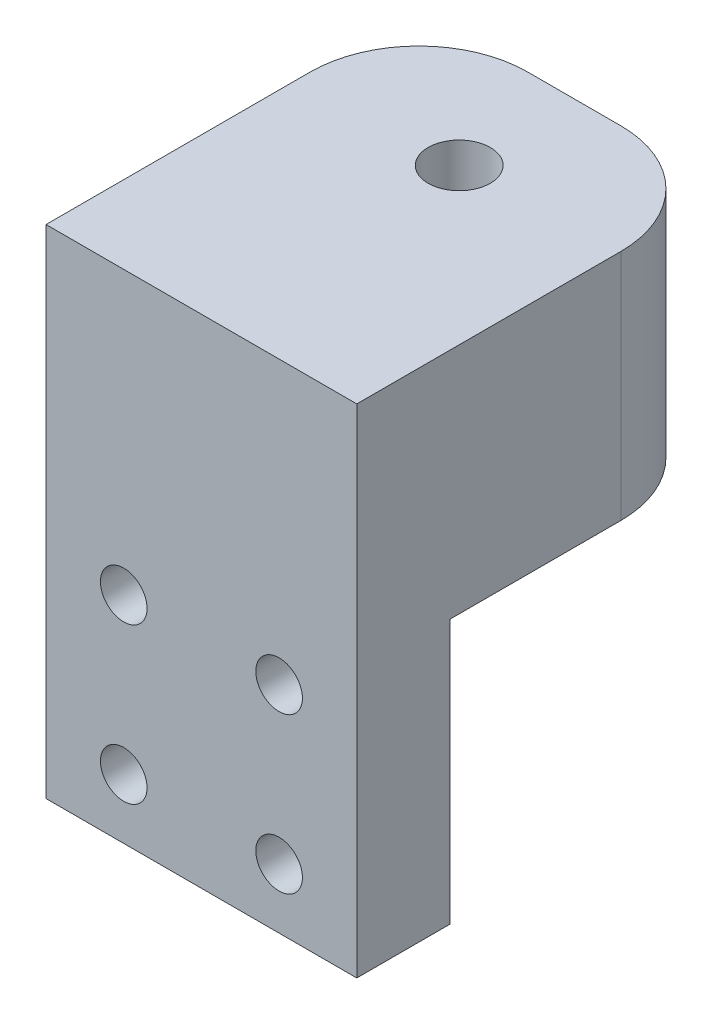
ISO-10303-21;
HEADER;
FILE_DESCRIPTION(('STEP AP214'),'2;1');
FILE_NAME('part.step','',(''),(''),'','','');
FILE_SCHEMA(('AUTOMOTIVE_DESIGN { 1 0 10303 214 1 1 1 1 }'));
ENDSEC;
DATA;
#1=APPLICATION_CONTEXT('core data for automotive mechanical design processes');
#2=APPLICATION_PROTOCOL_DEFINITION('international standard','automotive_design',2000,#1);
#3=PRODUCT_CONTEXT('',#1,'mechanical');
#4=PRODUCT('Part','Part','',(#3));
#5=PRODUCT_RELATED_PRODUCT_CATEGORY('part','',(#4));
#6=PRODUCT_DEFINITION_FORMATION('','',#4);
#7=PRODUCT_DEFINITION_CONTEXT('part definition',#1,'design');
#8=PRODUCT_DEFINITION('design','',#6,#7);
#9=PRODUCT_DEFINITION_SHAPE('','',#8);
#10=(LENGTH_UNIT() NAMED_UNIT(*) SI_UNIT(.MILLI.,.METRE.));
#11=(NAMED_UNIT(*) PLANE_ANGLE_UNIT() SI_UNIT($,.RADIAN.));
#12=(NAMED_UNIT(*) SI_UNIT($,.STERADIAN.) SOLID_ANGLE_UNIT());
#13=UNCERTAINTY_MEASURE_WITH_UNIT(LENGTH_MEASURE(1.E-05),#10,'distance_accuracy_value','');
#14=(GEOMETRIC_REPRESENTATION_CONTEXT(3) GLOBAL_UNCERTAINTY_ASSIGNED_CONTEXT((#13)) GLOBAL_UNIT_ASSIGNED_CONTEXT((#10,
#11,#12)) REPRESENTATION_CONTEXT('',''));
#15=CARTESIAN_POINT('',(0.,0.,0.));
#16=DIRECTION('',(0.,0.,1.));
#17=DIRECTION('',(1.,0.,0.));
#18=AXIS2_PLACEMENT_3D('',#15,#16,#17);
#19=CARTESIAN_POINT('',(-10.,0.,6.));
#20=DIRECTION('',(-1.,0.,0.));
#21=DIRECTION('',(0.,0.,1.));
#22=AXIS2_PLACEMENT_3D('',#19,#20,#21);
#23=PLANE('',#22);
#24=DIRECTION('',(0.,0.,1.));
#25=VECTOR('',#24,1.);
#26=CARTESIAN_POINT('',(-10.,22.,-18.));
#27=LINE('',#26,#25);
#28=CARTESIAN_POINT('',(-10.,22.,-11.));
#29=VERTEX_POINT('',#28);
#30=CARTESIAN_POINT('',(-10.,22.,6.));
#31=VERTEX_POINT('',#30);
#32=EDGE_CURVE('E229',#29,#31,#27,.T.);
#33=ORIENTED_EDGE('',*,*,#32,.F.);
#34=DIRECTION('',(0.,1.,0.));
#35=VECTOR('',#34,1.);
#36=CARTESIAN_POINT('',(-10.,-10.,-11.));
#37=LINE('',#36,#35);
#38=CARTESIAN_POINT('',(-10.,7.,-11.));
#39=VERTEX_POINT('',#38);
#40=EDGE_CURVE('E65',#39,#29,#37,.T.);
#41=ORIENTED_EDGE('',*,*,#40,.F.);
#42=DIRECTION('',(0.,0.,1.));
#43=VECTOR('',#42,1.);
#44=CARTESIAN_POINT('',(-10.,7.,-18.));
#45=LINE('',#44,#43);
#46=CARTESIAN_POINT('',(-10.,7.,0.));
#47=VERTEX_POINT('',#46);
#48=EDGE_CURVE('E142',#39,#47,#45,.T.);
#49=ORIENTED_EDGE('',*,*,#48,.T.);
#50=DIRECTION('',(0.,1.,0.));
#51=VECTOR('',#50,1.);
#52=CARTESIAN_POINT('',(-10.,0.,0.));
#53=LINE('',#52,#51);
#54=CARTESIAN_POINT('',(-10.,-10.,0.));
#55=VERTEX_POINT('',#54);
#56=EDGE_CURVE('E155',#55,#47,#53,.T.);
#57=ORIENTED_EDGE('',*,*,#56,.F.);
#58=DIRECTION('',(0.,0.,-1.));
#59=VECTOR('',#58,1.);
#60=CARTESIAN_POINT('',(-10.,-10.,6.));
#61=LINE('',#60,#59);
#62=CARTESIAN_POINT('',(-10.,-10.,6.));
#63=VERTEX_POINT('',#62);
#64=EDGE_CURVE('E50',#63,#55,#61,.T.);
#65=ORIENTED_EDGE('',*,*,#64,.F.);
#66=DIRECTION('',(0.,1.,0.));
#67=VECTOR('',#66,1.);
#68=CARTESIAN_POINT('',(-10.,0.,6.));
#69=LINE('',#68,#67);
#70=EDGE_CURVE('E174',#63,#31,#69,.T.);
#71=ORIENTED_EDGE('',*,*,#70,.T.);
#72=EDGE_LOOP('',(#33,#41,#49,#57,#65,#71));
#73=FACE_BOUND('',#72,.T.);
#74=ADVANCED_FACE('F41',(#73),#23,.T.);
#75=CARTESIAN_POINT('',(10.,7.,-18.));
#76=DIRECTION('',(0.,1.,0.));
#77=DIRECTION('',(-1.,0.,0.));
#78=AXIS2_PLACEMENT_3D('',#75,#76,#77);
#79=PLANE('',#78);
#80=CARTESIAN_POINT('',(0.,7.,-10.5910200588554));
#81=DIRECTION('',(0.,1.,0.));
#82=DIRECTION('',(-1.,0.,0.));
#83=AXIS2_PLACEMENT_3D('',#80,#81,#82);
#84=CIRCLE('',#83,2.);
#85=CARTESIAN_POINT('',(-2.,7.,-10.5910200588554));
#86=VERTEX_POINT('',#85);
#87=EDGE_CURVE('E234',#86,#86,#84,.T.);
#88=ORIENTED_EDGE('',*,*,#87,.T.);
#89=EDGE_LOOP('',(#88));
#90=FACE_BOUND('',#89,.T.);
#91=ORIENTED_EDGE('',*,*,#48,.F.);
#92=CARTESIAN_POINT('',(-3.,7.,-11.));
#93=DIRECTION('',(0.,1.,0.));
#94=DIRECTION('',(-1.,0.,0.));
#95=AXIS2_PLACEMENT_3D('',#92,#93,#94);
#96=CIRCLE('',#95,7.);
#97=CARTESIAN_POINT('',(-3.,7.,-18.));
#98=VERTEX_POINT('',#97);
#99=EDGE_CURVE('E218',#39,#98,#96,.F.);
#100=ORIENTED_EDGE('',*,*,#99,.T.);
#101=DIRECTION('',(-1.,0.,0.));
#102=VECTOR('',#101,1.);
#103=CARTESIAN_POINT('',(10.,7.,-18.));
#104=LINE('',#103,#102);
#105=CARTESIAN_POINT('',(3.,7.,-18.));
#106=VERTEX_POINT('',#105);
#107=EDGE_CURVE('E121',#106,#98,#104,.T.);
#108=ORIENTED_EDGE('',*,*,#107,.F.);
#109=CARTESIAN_POINT('',(3.,7.,-11.));
#110=DIRECTION('',(0.,1.,0.));
#111=DIRECTION('',(-1.,0.,0.));
#112=AXIS2_PLACEMENT_3D('',#109,#110,#111);
#113=CIRCLE('',#112,7.);
#114=CARTESIAN_POINT('',(10.,7.,-11.));
#115=VERTEX_POINT('',#114);
#116=EDGE_CURVE('E123',#115,#106,#113,.T.);
#117=ORIENTED_EDGE('',*,*,#116,.F.);
#118=DIRECTION('',(0.,0.,1.));
#119=VECTOR('',#118,1.);
#120=CARTESIAN_POINT('',(10.,7.,-18.));
#121=LINE('',#120,#119);
#122=CARTESIAN_POINT('',(10.,7.,0.));
#123=VERTEX_POINT('',#122);
#124=EDGE_CURVE('E146',#115,#123,#121,.T.);
#125=ORIENTED_EDGE('',*,*,#124,.T.);
#126=DIRECTION('',(-1.,0.,0.));
#127=VECTOR('',#126,1.);
#128=CARTESIAN_POINT('',(10.,7.,0.));
#129=LINE('',#128,#127);
#130=EDGE_CURVE('E130',#123,#47,#129,.T.);
#131=ORIENTED_EDGE('',*,*,#130,.T.);
#132=EDGE_LOOP('',(#91,#100,#108,#117,#125,#131));
#133=FACE_BOUND('',#132,.T.);
#134=ADVANCED_FACE('F217',(#90,#133),#79,.F.);
#135=CARTESIAN_POINT('',(0.,22.,0.));
#136=DIRECTION('',(0.,1.,0.));
#137=DIRECTION('',(0.,0.,1.));
#138=AXIS2_PLACEMENT_3D('',#135,#136,#137);
#139=PLANE('',#138);
#140=CARTESIAN_POINT('',(-3.,22.,-11.));
#141=DIRECTION('',(0.,1.,0.));
#142=DIRECTION('',(0.,0.,1.));
#143=AXIS2_PLACEMENT_3D('',#140,#141,#142);
#144=CIRCLE('',#143,7.);
#145=CARTESIAN_POINT('',(-3.,22.,-18.));
#146=VERTEX_POINT('',#145);
#147=EDGE_CURVE('E104',#29,#146,#144,.F.);
#148=ORIENTED_EDGE('',*,*,#147,.F.);
#149=ORIENTED_EDGE('',*,*,#32,.T.);
#150=DIRECTION('',(1.,0.,0.));
#151=VECTOR('',#150,1.);
#152=CARTESIAN_POINT('',(-10.,22.,6.));
#153=LINE('',#152,#151);
#154=CARTESIAN_POINT('',(10.,22.,6.));
#155=VERTEX_POINT('',#154);
#156=EDGE_CURVE('E137',#31,#155,#153,.T.);
#157=ORIENTED_EDGE('',*,*,#156,.T.);
#158=DIRECTION('',(0.,0.,-1.));
#159=VECTOR('',#158,1.);
#160=CARTESIAN_POINT('',(10.,22.,-18.));
#161=LINE('',#160,#159);
#162=CARTESIAN_POINT('',(10.,22.,-11.));
#163=VERTEX_POINT('',#162);
#164=EDGE_CURVE('E131',#155,#163,#161,.T.);
#165=ORIENTED_EDGE('',*,*,#164,.T.);
#166=CARTESIAN_POINT('',(3.,22.,-11.));
#167=DIRECTION('',(0.,1.,0.));
#168=DIRECTION('',(0.,0.,1.));
#169=AXIS2_PLACEMENT_3D('',#166,#167,#168);
#170=CIRCLE('',#169,7.);
#171=CARTESIAN_POINT('',(3.,22.,-18.));
#172=VERTEX_POINT('',#171);
#173=EDGE_CURVE('E128',#163,#172,#170,.T.);
#174=ORIENTED_EDGE('',*,*,#173,.T.);
#175=DIRECTION('',(-1.,0.,0.));
#176=VECTOR('',#175,1.);
#177=CARTESIAN_POINT('',(-10.,22.,-18.));
#178=LINE('',#177,#176);
#179=EDGE_CURVE('E119',#172,#146,#178,.T.);
#180=ORIENTED_EDGE('',*,*,#179,.T.);
#181=EDGE_LOOP('',(#148,#149,#157,#165,#174,#180));
#182=FACE_BOUND('',#181,.T.);
#183=CARTESIAN_POINT('',(0.,22.,-10.5910200588554));
#184=DIRECTION('',(0.,1.,0.));
#185=DIRECTION('',(0.,0.,1.));
#186=AXIS2_PLACEMENT_3D('',#183,#184,#185);
#187=CIRCLE('',#186,2.);
#188=CARTESIAN_POINT('',(0.,22.,-8.59102005885545));
#189=VERTEX_POINT('',#188);
#190=EDGE_CURVE('E113',#189,#189,#187,.T.);
#191=ORIENTED_EDGE('',*,*,#190,.F.);
#192=EDGE_LOOP('',(#191));
#193=FACE_BOUND('',#192,.T.);
#194=ADVANCED_FACE('F125',(#182,#193),#139,.T.);
#195=CARTESIAN_POINT('',(0.,0.,0.));
#196=DIRECTION('',(0.,0.,1.));
#197=DIRECTION('',(1.,0.,0.));
#198=AXIS2_PLACEMENT_3D('',#195,#196,#197);
#199=PLANE('',#198);
#200=CARTESIAN_POINT('',(-5.,-6.15204282368808,0.));
#201=DIRECTION('',(0.,0.,1.));
#202=DIRECTION('',(1.,0.,0.));
#203=AXIS2_PLACEMENT_3D('',#200,#201,#202);
#204=CIRCLE('',#203,1.5);
#205=CARTESIAN_POINT('',(-3.5,-6.15204282368808,0.));
#206=VERTEX_POINT('',#205);
#207=EDGE_CURVE('E189',#206,#206,#204,.T.);
#208=ORIENTED_EDGE('',*,*,#207,.T.);
#209=EDGE_LOOP('',(#208));
#210=FACE_BOUND('',#209,.T.);
#211=CARTESIAN_POINT('',(5.,3.84795717631192,0.));
#212=DIRECTION('',(0.,0.,1.));
#213=DIRECTION('',(1.,0.,0.));
#214=AXIS2_PLACEMENT_3D('',#211,#212,#213);
#215=CIRCLE('',#214,1.5);
#216=CARTESIAN_POINT('',(6.5,3.84795717631192,0.));
#217=VERTEX_POINT('',#216);
#218=EDGE_CURVE('E185',#217,#217,#215,.T.);
#219=ORIENTED_EDGE('',*,*,#218,.T.);
#220=EDGE_LOOP('',(#219));
#221=FACE_BOUND('',#220,.T.);
#222=CARTESIAN_POINT('',(-5.,3.84795717631192,0.));
#223=DIRECTION('',(0.,0.,1.));
#224=DIRECTION('',(1.,0.,0.));
#225=AXIS2_PLACEMENT_3D('',#222,#223,#224);
#226=CIRCLE('',#225,1.5);
#227=CARTESIAN_POINT('',(-3.5,3.84795717631192,0.));
#228=VERTEX_POINT('',#227);
#229=EDGE_CURVE('E181',#228,#228,#226,.T.);
#230=ORIENTED_EDGE('',*,*,#229,.T.);
#231=EDGE_LOOP('',(#230));
#232=FACE_BOUND('',#231,.T.);
#233=CARTESIAN_POINT('',(5.,-6.15204282368808,0.));
#234=DIRECTION('',(0.,0.,1.));
#235=DIRECTION('',(1.,0.,0.));
#236=AXIS2_PLACEMENT_3D('',#233,#234,#235);
#237=CIRCLE('',#236,1.5);
#238=CARTESIAN_POINT('',(6.5,-6.15204282368808,0.));
#239=VERTEX_POINT('',#238);
#240=EDGE_CURVE('E149',#239,#239,#237,.T.);
#241=ORIENTED_EDGE('',*,*,#240,.T.);
#242=EDGE_LOOP('',(#241));
#243=FACE_BOUND('',#242,.T.);
#244=ORIENTED_EDGE('',*,*,#130,.F.);
#245=DIRECTION('',(0.,1.,0.));
#246=VECTOR('',#245,1.);
#247=CARTESIAN_POINT('',(10.,0.,0.));
#248=LINE('',#247,#246);
#249=CARTESIAN_POINT('',(10.,-10.,0.));
#250=VERTEX_POINT('',#249);
#251=EDGE_CURVE('E197',#250,#123,#248,.T.);
#252=ORIENTED_EDGE('',*,*,#251,.F.);
#253=DIRECTION('',(1.,0.,0.));
#254=VECTOR('',#253,1.);
#255=CARTESIAN_POINT('',(0.,-10.,0.));
#256=LINE('',#255,#254);
#257=EDGE_CURVE('E193',#55,#250,#256,.T.);
#258=ORIENTED_EDGE('',*,*,#257,.F.);
#259=ORIENTED_EDGE('',*,*,#56,.T.);
#260=EDGE_LOOP('',(#244,#252,#258,#259));
#261=FACE_BOUND('',#260,.T.);
#262=ADVANCED_FACE('F214',(#210,#221,#232,#243,#261),#199,.F.);
#263=CARTESIAN_POINT('',(0.,-10.,6.));
#264=DIRECTION('',(0.,1.,0.));
#265=DIRECTION('',(0.,0.,1.));
#266=AXIS2_PLACEMENT_3D('',#263,#264,#265);
#267=PLANE('',#266);
#268=ORIENTED_EDGE('',*,*,#257,.T.);
#269=DIRECTION('',(0.,0.,-1.));
#270=VECTOR('',#269,1.);
#271=CARTESIAN_POINT('',(10.,-10.,6.));
#272=LINE('',#271,#270);
#273=CARTESIAN_POINT('',(10.,-10.,6.));
#274=VERTEX_POINT('',#273);
#275=EDGE_CURVE('E11',#274,#250,#272,.T.);
#276=ORIENTED_EDGE('',*,*,#275,.F.);
#277=DIRECTION('',(1.,0.,0.));
#278=VECTOR('',#277,1.);
#279=CARTESIAN_POINT('',(0.,-10.,6.));
#280=LINE('',#279,#278);
#281=EDGE_CURVE('E167',#63,#274,#280,.T.);
#282=ORIENTED_EDGE('',*,*,#281,.F.);
#283=ORIENTED_EDGE('',*,*,#64,.T.);
#284=EDGE_LOOP('',(#268,#276,#282,#283));
#285=FACE_BOUND('',#284,.T.);
#286=ADVANCED_FACE('F207',(#285),#267,.F.);
#287=CARTESIAN_POINT('',(10.,0.,6.));
#288=DIRECTION('',(-1.,0.,0.));
#289=DIRECTION('',(0.,0.,1.));
#290=AXIS2_PLACEMENT_3D('',#287,#288,#289);
#291=PLANE('',#290);
#292=ORIENTED_EDGE('',*,*,#124,.F.);
#293=DIRECTION('',(0.,1.,0.));
#294=VECTOR('',#293,1.);
#295=CARTESIAN_POINT('',(10.,-10.,-11.));
#296=LINE('',#295,#294);
#297=EDGE_CURVE('E242',#115,#163,#296,.T.);
#298=ORIENTED_EDGE('',*,*,#297,.T.);
#299=ORIENTED_EDGE('',*,*,#164,.F.);
#300=DIRECTION('',(0.,1.,0.));
#301=VECTOR('',#300,1.);
#302=CARTESIAN_POINT('',(10.,0.,6.));
#303=LINE('',#302,#301);
#304=EDGE_CURVE('E171',#274,#155,#303,.T.);
#305=ORIENTED_EDGE('',*,*,#304,.F.);
#306=ORIENTED_EDGE('',*,*,#275,.T.);
#307=ORIENTED_EDGE('',*,*,#251,.T.);
#308=EDGE_LOOP('',(#292,#298,#299,#305,#306,#307));
#309=FACE_BOUND('',#308,.T.);
#310=ADVANCED_FACE('F222',(#309),#291,.F.);
#311=CARTESIAN_POINT('',(-5.,-6.15204282368808,6.));
#312=DIRECTION('',(0.,0.,-1.));
#313=DIRECTION('',(-1.,0.,0.));
#314=AXIS2_PLACEMENT_3D('',#311,#312,#313);
#315=CYLINDRICAL_SURFACE('',#314,1.5);
#316=CARTESIAN_POINT('',(-5.,-6.15204282368808,6.));
#317=DIRECTION('',(0.,0.,1.));
#318=DIRECTION('',(1.,0.,0.));
#319=AXIS2_PLACEMENT_3D('',#316,#317,#318);
#320=CIRCLE('',#319,1.5);
#321=CARTESIAN_POINT('',(-3.5,-6.15204282368808,6.));
#322=VERTEX_POINT('',#321);
#323=EDGE_CURVE('E163',#322,#322,#320,.T.);
#324=ORIENTED_EDGE('',*,*,#323,.T.);
#325=EDGE_LOOP('',(#324));
#326=FACE_BOUND('',#325,.T.);
#327=ORIENTED_EDGE('',*,*,#207,.F.);
#328=EDGE_LOOP('',(#327));
#329=FACE_BOUND('',#328,.T.);
#330=ADVANCED_FACE('F277',(#326,#329),#315,.F.);
#331=CARTESIAN_POINT('',(5.,3.84795717631192,6.));
#332=DIRECTION('',(0.,0.,-1.));
#333=DIRECTION('',(-1.,0.,0.));
#334=AXIS2_PLACEMENT_3D('',#331,#332,#333);
#335=CYLINDRICAL_SURFACE('',#334,1.5);
#336=CARTESIAN_POINT('',(5.,3.84795717631192,6.));
#337=DIRECTION('',(0.,0.,1.));
#338=DIRECTION('',(1.,0.,0.));
#339=AXIS2_PLACEMENT_3D('',#336,#337,#338);
#340=CIRCLE('',#339,1.5);
#341=CARTESIAN_POINT('',(6.5,3.84795717631192,6.));
#342=VERTEX_POINT('',#341);
#343=EDGE_CURVE('E159',#342,#342,#340,.T.);
#344=ORIENTED_EDGE('',*,*,#343,.T.);
#345=EDGE_LOOP('',(#344));
#346=FACE_BOUND('',#345,.T.);
#347=ORIENTED_EDGE('',*,*,#218,.F.);
#348=EDGE_LOOP('',(#347));
#349=FACE_BOUND('',#348,.T.);
#350=ADVANCED_FACE('F282',(#346,#349),#335,.F.);
#351=CARTESIAN_POINT('',(-5.,3.84795717631192,6.));
#352=DIRECTION('',(0.,0.,-1.));
#353=DIRECTION('',(-1.,0.,0.));
#354=AXIS2_PLACEMENT_3D('',#351,#352,#353);
#355=CYLINDRICAL_SURFACE('',#354,1.5);
#356=CARTESIAN_POINT('',(-5.,3.84795717631192,6.));
#357=DIRECTION('',(0.,0.,1.));
#358=DIRECTION('',(1.,0.,0.));
#359=AXIS2_PLACEMENT_3D('',#356,#357,#358);
#360=CIRCLE('',#359,1.5);
#361=CARTESIAN_POINT('',(-3.5,3.84795717631192,6.));
#362=VERTEX_POINT('',#361);
#363=EDGE_CURVE('E154',#362,#362,#360,.T.);
#364=ORIENTED_EDGE('',*,*,#363,.T.);
#365=EDGE_LOOP('',(#364));
#366=FACE_BOUND('',#365,.T.);
#367=ORIENTED_EDGE('',*,*,#229,.F.);
#368=EDGE_LOOP('',(#367));
#369=FACE_BOUND('',#368,.T.);
#370=ADVANCED_FACE('F285',(#366,#369),#355,.F.);
#371=CARTESIAN_POINT('',(5.,-6.15204282368808,6.));
#372=DIRECTION('',(0.,0.,-1.));
#373=DIRECTION('',(-1.,0.,0.));
#374=AXIS2_PLACEMENT_3D('',#371,#372,#373);
#375=CYLINDRICAL_SURFACE('',#374,1.5);
#376=CARTESIAN_POINT('',(5.,-6.15204282368808,6.));
#377=DIRECTION('',(0.,0.,1.));
#378=DIRECTION('',(1.,0.,0.));
#379=AXIS2_PLACEMENT_3D('',#376,#377,#378);
#380=CIRCLE('',#379,1.5);
#381=CARTESIAN_POINT('',(6.5,-6.15204282368808,6.));
#382=VERTEX_POINT('',#381);
#383=EDGE_CURVE('E150',#382,#382,#380,.T.);
#384=ORIENTED_EDGE('',*,*,#383,.T.);
#385=EDGE_LOOP('',(#384));
#386=FACE_BOUND('',#385,.T.);
#387=ORIENTED_EDGE('',*,*,#240,.F.);
#388=EDGE_LOOP('',(#387));
#389=FACE_BOUND('',#388,.T.);
#390=ADVANCED_FACE('F43',(#386,#389),#375,.F.);
#391=CARTESIAN_POINT('',(0.,0.,6.));
#392=DIRECTION('',(0.,0.,1.));
#393=DIRECTION('',(1.,0.,0.));
#394=AXIS2_PLACEMENT_3D('',#391,#392,#393);
#395=PLANE('',#394);
#396=ORIENTED_EDGE('',*,*,#383,.F.);
#397=EDGE_LOOP('',(#396));
#398=FACE_BOUND('',#397,.T.);
#399=ORIENTED_EDGE('',*,*,#363,.F.);
#400=EDGE_LOOP('',(#399));
#401=FACE_BOUND('',#400,.T.);
#402=ORIENTED_EDGE('',*,*,#343,.F.);
#403=EDGE_LOOP('',(#402));
#404=FACE_BOUND('',#403,.T.);
#405=ORIENTED_EDGE('',*,*,#323,.F.);
#406=EDGE_LOOP('',(#405));
#407=FACE_BOUND('',#406,.T.);
#408=ORIENTED_EDGE('',*,*,#281,.T.);
#409=ORIENTED_EDGE('',*,*,#304,.T.);
#410=ORIENTED_EDGE('',*,*,#156,.F.);
#411=ORIENTED_EDGE('',*,*,#70,.F.);
#412=EDGE_LOOP('',(#408,#409,#410,#411));
#413=FACE_BOUND('',#412,.T.);
#414=ADVANCED_FACE('F228',(#398,#401,#404,#407,#413),#395,.T.);
#415=CARTESIAN_POINT('',(0.,0.,-18.));
#416=DIRECTION('',(0.,0.,-1.));
#417=DIRECTION('',(-1.,0.,0.));
#418=AXIS2_PLACEMENT_3D('',#415,#416,#417);
#419=PLANE('',#418);
#420=DIRECTION('',(0.,1.,0.));
#421=VECTOR('',#420,1.);
#422=CARTESIAN_POINT('',(-3.,-10.,-18.));
#423=LINE('',#422,#421);
#424=EDGE_CURVE('E107',#98,#146,#423,.T.);
#425=ORIENTED_EDGE('',*,*,#424,.T.);
#426=ORIENTED_EDGE('',*,*,#179,.F.);
#427=DIRECTION('',(0.,1.,0.));
#428=VECTOR('',#427,1.);
#429=CARTESIAN_POINT('',(3.,-10.,-18.));
#430=LINE('',#429,#428);
#431=EDGE_CURVE('E57',#106,#172,#430,.T.);
#432=ORIENTED_EDGE('',*,*,#431,.F.);
#433=ORIENTED_EDGE('',*,*,#107,.T.);
#434=EDGE_LOOP('',(#425,#426,#432,#433));
#435=FACE_BOUND('',#434,.T.);
#436=ADVANCED_FACE('F118',(#435),#419,.T.);
#437=CARTESIAN_POINT('',(3.,-10.,-11.));
#438=DIRECTION('',(0.,1.,0.));
#439=DIRECTION('',(0.,0.,1.));
#440=AXIS2_PLACEMENT_3D('',#437,#438,#439);
#441=CYLINDRICAL_SURFACE('',#440,7.);
#442=ORIENTED_EDGE('',*,*,#116,.T.);
#443=ORIENTED_EDGE('',*,*,#431,.T.);
#444=ORIENTED_EDGE('',*,*,#173,.F.);
#445=ORIENTED_EDGE('',*,*,#297,.F.);
#446=EDGE_LOOP('',(#442,#443,#444,#445));
#447=FACE_BOUND('',#446,.T.);
#448=ADVANCED_FACE('F315',(#447),#441,.T.);
#449=CARTESIAN_POINT('',(0.,-10.,-10.5910200588554));
#450=DIRECTION('',(0.,1.,0.));
#451=DIRECTION('',(0.,0.,1.));
#452=AXIS2_PLACEMENT_3D('',#449,#450,#451);
#453=CYLINDRICAL_SURFACE('',#452,2.);
#454=ORIENTED_EDGE('',*,*,#190,.T.);
#455=EDGE_LOOP('',(#454));
#456=FACE_BOUND('',#455,.T.);
#457=ORIENTED_EDGE('',*,*,#87,.F.);
#458=EDGE_LOOP('',(#457));
#459=FACE_BOUND('',#458,.T.);
#460=ADVANCED_FACE('F255',(#456,#459),#453,.F.);
#461=CARTESIAN_POINT('',(-3.,-10.,-11.));
#462=DIRECTION('',(0.,1.,0.));
#463=DIRECTION('',(0.,0.,1.));
#464=AXIS2_PLACEMENT_3D('',#461,#462,#463);
#465=CYLINDRICAL_SURFACE('',#464,7.);
#466=ORIENTED_EDGE('',*,*,#40,.T.);
#467=ORIENTED_EDGE('',*,*,#147,.T.);
#468=ORIENTED_EDGE('',*,*,#424,.F.);
#469=ORIENTED_EDGE('',*,*,#99,.F.);
#470=EDGE_LOOP('',(#466,#467,#468,#469));
#471=FACE_BOUND('',#470,.T.);
#472=ADVANCED_FACE('F106',(#471),#465,.T.);
#473=CLOSED_SHELL('',(#74,#134,#194,#262,#286,#310,#330,#350,#370,#390,#414,#436,#448,#460,#472));
#474=MANIFOLD_SOLID_BREP('B2',#473);
#475=ADVANCED_BREP_SHAPE_REPRESENTATION('',(#18,#474),#14);
#476=SHAPE_DEFINITION_REPRESENTATION(#9,#475);
ENDSEC;
END-ISO-10303-21;
